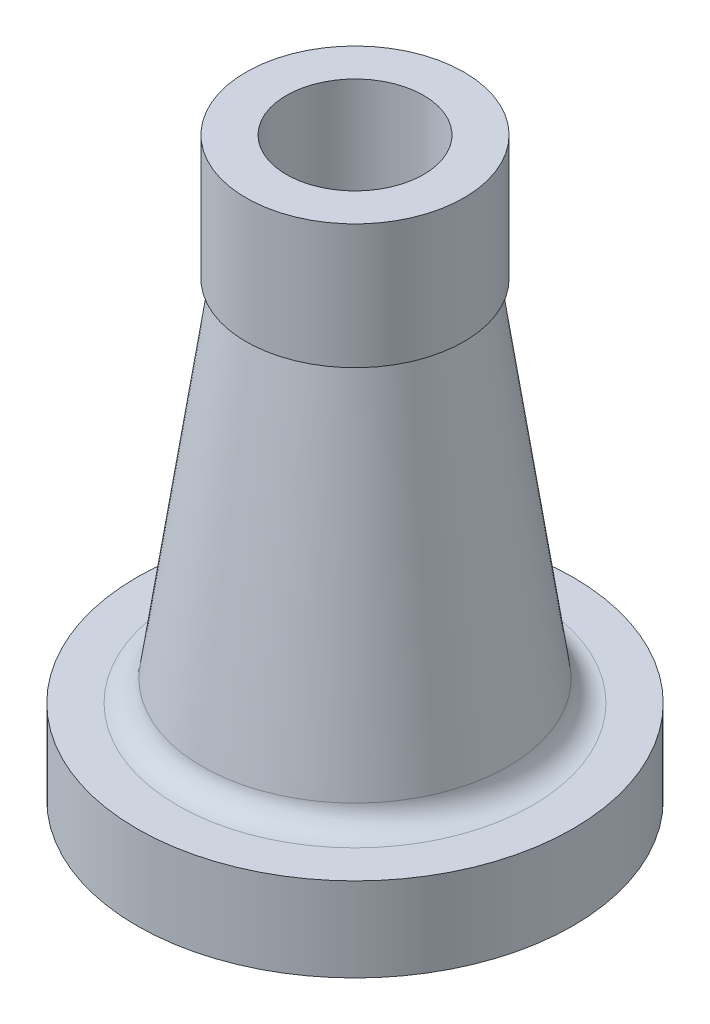
ISO-10303-21;
HEADER;
FILE_DESCRIPTION(('STEP AP214'),'2;1');
FILE_NAME('part.step','',(''),(''),'','','');
FILE_SCHEMA(('AUTOMOTIVE_DESIGN { 1 0 10303 214 1 1 1 1 }'));
ENDSEC;
DATA;
#1=APPLICATION_CONTEXT('core data for automotive mechanical design processes');
#2=APPLICATION_PROTOCOL_DEFINITION('international standard','automotive_design',2000,#1);
#3=PRODUCT_CONTEXT('',#1,'mechanical');
#4=PRODUCT('Part','Part','',(#3));
#5=PRODUCT_RELATED_PRODUCT_CATEGORY('part','',(#4));
#6=PRODUCT_DEFINITION_FORMATION('','',#4);
#7=PRODUCT_DEFINITION_CONTEXT('part definition',#1,'design');
#8=PRODUCT_DEFINITION('design','',#6,#7);
#9=PRODUCT_DEFINITION_SHAPE('','',#8);
#10=(LENGTH_UNIT() NAMED_UNIT(*) SI_UNIT(.MILLI.,.METRE.));
#11=(NAMED_UNIT(*) PLANE_ANGLE_UNIT() SI_UNIT($,.RADIAN.));
#12=(NAMED_UNIT(*) SI_UNIT($,.STERADIAN.) SOLID_ANGLE_UNIT());
#13=UNCERTAINTY_MEASURE_WITH_UNIT(LENGTH_MEASURE(1.E-05),#10,'distance_accuracy_value','');
#14=(GEOMETRIC_REPRESENTATION_CONTEXT(3) GLOBAL_UNCERTAINTY_ASSIGNED_CONTEXT((#13)) GLOBAL_UNIT_ASSIGNED_CONTEXT((#10,
#11,#12)) REPRESENTATION_CONTEXT('',''));
#15=CARTESIAN_POINT('',(0.,0.,0.));
#16=DIRECTION('',(0.,0.,1.));
#17=DIRECTION('',(1.,0.,0.));
#18=AXIS2_PLACEMENT_3D('',#15,#16,#17);
#19=CARTESIAN_POINT('',(-50.,0.,0.));
#20=DIRECTION('',(0.,1.,0.));
#21=DIRECTION('',(0.,0.,1.));
#22=AXIS2_PLACEMENT_3D('',#19,#20,#21);
#23=PLANE('',#22);
#24=CARTESIAN_POINT('',(0.,0.,0.));
#25=DIRECTION('',(0.,-1.,0.));
#26=DIRECTION('',(0.,0.,-1.));
#27=AXIS2_PLACEMENT_3D('',#24,#25,#26);
#28=CIRCLE('',#27,50.);
#29=CARTESIAN_POINT('',(0.,0.,-50.));
#30=VERTEX_POINT('',#29);
#31=EDGE_CURVE('E10',#30,#30,#28,.T.);
#32=ORIENTED_EDGE('',*,*,#31,.F.);
#33=EDGE_LOOP('',(#32));
#34=FACE_BOUND('',#33,.T.);
#35=CARTESIAN_POINT('',(0.,0.,0.));
#36=DIRECTION('',(0.,-1.,0.));
#37=DIRECTION('',(0.,0.,-1.));
#38=AXIS2_PLACEMENT_3D('',#35,#36,#37);
#39=CIRCLE('',#38,70.);
#40=CARTESIAN_POINT('',(0.,0.,-70.));
#41=VERTEX_POINT('',#40);
#42=EDGE_CURVE('E77',#41,#41,#39,.T.);
#43=ORIENTED_EDGE('',*,*,#42,.T.);
#44=EDGE_LOOP('',(#43));
#45=FACE_BOUND('',#44,.T.);
#46=ADVANCED_FACE('F40',(#34,#45),#23,.F.);
#47=CARTESIAN_POINT('',(0.,0.,0.));
#48=DIRECTION('',(0.,-1.,0.));
#49=DIRECTION('',(0.,0.,-1.));
#50=AXIS2_PLACEMENT_3D('',#47,#48,#49);
#51=CYLINDRICAL_SURFACE('',#50,50.);
#52=CARTESIAN_POINT('',(0.,3.,0.));
#53=DIRECTION('',(0.,-1.,0.));
#54=DIRECTION('',(0.,0.,-1.));
#55=AXIS2_PLACEMENT_3D('',#52,#53,#54);
#56=CIRCLE('',#55,50.);
#57=CARTESIAN_POINT('',(0.,3.,-50.));
#58=VERTEX_POINT('',#57);
#59=EDGE_CURVE('E43',#58,#58,#56,.T.);
#60=ORIENTED_EDGE('',*,*,#59,.F.);
#61=EDGE_LOOP('',(#60));
#62=FACE_BOUND('',#61,.T.);
#63=ORIENTED_EDGE('',*,*,#31,.T.);
#64=EDGE_LOOP('',(#63));
#65=FACE_BOUND('',#64,.T.);
#66=ADVANCED_FACE('F138',(#62,#65),#51,.F.);
#67=CARTESIAN_POINT('',(-40.411605893821,3.,0.));
#68=DIRECTION('',(0.,1.,0.));
#69=DIRECTION('',(0.,0.,1.));
#70=AXIS2_PLACEMENT_3D('',#67,#68,#69);
#71=PLANE('',#70);
#72=CARTESIAN_POINT('',(0.,3.,0.));
#73=DIRECTION('',(0.,-1.,0.));
#74=DIRECTION('',(0.,0.,-1.));
#75=AXIS2_PLACEMENT_3D('',#72,#73,#74);
#76=CIRCLE('',#75,40.411605893821);
#77=CARTESIAN_POINT('',(0.,3.,-40.411605893821));
#78=VERTEX_POINT('',#77);
#79=EDGE_CURVE('E50',#78,#78,#76,.T.);
#80=ORIENTED_EDGE('',*,*,#79,.F.);
#81=EDGE_LOOP('',(#80));
#82=FACE_BOUND('',#81,.T.);
#83=ORIENTED_EDGE('',*,*,#59,.T.);
#84=EDGE_LOOP('',(#83));
#85=FACE_BOUND('',#84,.T.);
#86=ADVANCED_FACE('F133',(#82,#85),#71,.F.);
#87=CARTESIAN_POINT('',(0.,3.,0.));
#88=DIRECTION('',(0.,-1.,0.));
#89=DIRECTION('',(0.,0.,-1.));
#90=AXIS2_PLACEMENT_3D('',#87,#88,#89);
#91=CONICAL_SURFACE('',#90,40.411605893821,0.143699780089837);
#92=CARTESIAN_POINT('',(0.,130.,0.));
#93=DIRECTION('',(0.,-1.,0.));
#94=DIRECTION('',(0.,0.,-1.));
#95=AXIS2_PLACEMENT_3D('',#92,#93,#94);
#96=CIRCLE('',#95,22.0350698111545);
#97=CARTESIAN_POINT('',(0.,130.,-22.0350698111545));
#98=VERTEX_POINT('',#97);
#99=EDGE_CURVE('E51',#98,#98,#96,.T.);
#100=ORIENTED_EDGE('',*,*,#99,.F.);
#101=EDGE_LOOP('',(#100));
#102=FACE_BOUND('',#101,.T.);
#103=ORIENTED_EDGE('',*,*,#79,.T.);
#104=EDGE_LOOP('',(#103));
#105=FACE_BOUND('',#104,.T.);
#106=ADVANCED_FACE('F130',(#102,#105),#91,.F.);
#107=CARTESIAN_POINT('',(0.,0.,0.));
#108=DIRECTION('',(0.,-1.,0.));
#109=DIRECTION('',(0.,0.,-1.));
#110=AXIS2_PLACEMENT_3D('',#107,#108,#109);
#111=CYLINDRICAL_SURFACE('',#110,22.0350698111545);
#112=CARTESIAN_POINT('',(0.,185.,0.));
#113=DIRECTION('',(0.,-1.,0.));
#114=DIRECTION('',(0.,0.,-1.));
#115=AXIS2_PLACEMENT_3D('',#112,#113,#114);
#116=CIRCLE('',#115,22.0350698111545);
#117=CARTESIAN_POINT('',(0.,185.,-22.0350698111545));
#118=VERTEX_POINT('',#117);
#119=EDGE_CURVE('E57',#118,#118,#116,.T.);
#120=ORIENTED_EDGE('',*,*,#119,.F.);
#121=EDGE_LOOP('',(#120));
#122=FACE_BOUND('',#121,.T.);
#123=ORIENTED_EDGE('',*,*,#99,.T.);
#124=EDGE_LOOP('',(#123));
#125=FACE_BOUND('',#124,.T.);
#126=ADVANCED_FACE('F123',(#122,#125),#111,.F.);
#127=CARTESIAN_POINT('',(-35.,185.,0.));
#128=DIRECTION('',(0.,-1.,0.));
#129=DIRECTION('',(0.,0.,-1.));
#130=AXIS2_PLACEMENT_3D('',#127,#128,#129);
#131=PLANE('',#130);
#132=CARTESIAN_POINT('',(0.,185.,0.));
#133=DIRECTION('',(0.,-1.,0.));
#134=DIRECTION('',(0.,0.,-1.));
#135=AXIS2_PLACEMENT_3D('',#132,#133,#134);
#136=CIRCLE('',#135,35.);
#137=CARTESIAN_POINT('',(0.,185.,-35.));
#138=VERTEX_POINT('',#137);
#139=EDGE_CURVE('E56',#138,#138,#136,.T.);
#140=ORIENTED_EDGE('',*,*,#139,.F.);
#141=EDGE_LOOP('',(#140));
#142=FACE_BOUND('',#141,.T.);
#143=ORIENTED_EDGE('',*,*,#119,.T.);
#144=EDGE_LOOP('',(#143));
#145=FACE_BOUND('',#144,.T.);
#146=ADVANCED_FACE('F113',(#142,#145),#131,.F.);
#147=CARTESIAN_POINT('',(0.,0.,0.));
#148=DIRECTION('',(0.,-1.,0.));
#149=DIRECTION('',(0.,0.,-1.));
#150=AXIS2_PLACEMENT_3D('',#147,#148,#149);
#151=CYLINDRICAL_SURFACE('',#150,35.);
#152=CARTESIAN_POINT('',(0.,145.,0.));
#153=DIRECTION('',(0.,-1.,0.));
#154=DIRECTION('',(0.,0.,-1.));
#155=AXIS2_PLACEMENT_3D('',#152,#153,#154);
#156=CIRCLE('',#155,35.);
#157=CARTESIAN_POINT('',(0.,145.,-35.));
#158=VERTEX_POINT('',#157);
#159=EDGE_CURVE('E65',#158,#158,#156,.T.);
#160=ORIENTED_EDGE('',*,*,#159,.F.);
#161=EDGE_LOOP('',(#160));
#162=FACE_BOUND('',#161,.T.);
#163=ORIENTED_EDGE('',*,*,#139,.T.);
#164=EDGE_LOOP('',(#163));
#165=FACE_BOUND('',#164,.T.);
#166=ADVANCED_FACE('F109',(#162,#165),#151,.T.);
#167=CARTESIAN_POINT('',(-33.,145.,0.));
#168=DIRECTION('',(0.,1.,0.));
#169=DIRECTION('',(0.,0.,1.));
#170=AXIS2_PLACEMENT_3D('',#167,#168,#169);
#171=PLANE('',#170);
#172=CARTESIAN_POINT('',(0.,145.,0.));
#173=DIRECTION('',(0.,-1.,0.));
#174=DIRECTION('',(0.,0.,-1.));
#175=AXIS2_PLACEMENT_3D('',#172,#173,#174);
#176=CIRCLE('',#175,33.);
#177=CARTESIAN_POINT('',(0.,145.,-33.));
#178=VERTEX_POINT('',#177);
#179=EDGE_CURVE('E61',#178,#178,#176,.T.);
#180=ORIENTED_EDGE('',*,*,#179,.F.);
#181=EDGE_LOOP('',(#180));
#182=FACE_BOUND('',#181,.T.);
#183=ORIENTED_EDGE('',*,*,#159,.T.);
#184=EDGE_LOOP('',(#183));
#185=FACE_BOUND('',#184,.T.);
#186=ADVANCED_FACE('F104',(#182,#185),#171,.F.);
#187=CARTESIAN_POINT('',(0.,145.,0.));
#188=DIRECTION('',(0.,-1.,0.));
#189=DIRECTION('',(0.,0.,-1.));
#190=AXIS2_PLACEMENT_3D('',#187,#188,#189);
#191=CONICAL_SURFACE('',#190,33.,0.143699780089837);
#192=CARTESIAN_POINT('',(0.,33.8543541387552,0.));
#193=DIRECTION('',(0.,-1.,0.));
#194=DIRECTION('',(0.,0.,-1.));
#195=AXIS2_PLACEMENT_3D('',#192,#193,#194);
#196=CIRCLE('',#195,49.0824564692947);
#197=CARTESIAN_POINT('',(0.,33.8543541387552,-49.0824564692947));
#198=VERTEX_POINT('',#197);
#199=EDGE_CURVE('E66',#198,#198,#196,.T.);
#200=ORIENTED_EDGE('',*,*,#199,.F.);
#201=EDGE_LOOP('',(#200));
#202=FACE_BOUND('',#201,.T.);
#203=ORIENTED_EDGE('',*,*,#179,.T.);
#204=EDGE_LOOP('',(#203));
#205=FACE_BOUND('',#204,.T.);
#206=ADVANCED_FACE('F100',(#202,#205),#191,.T.);
#207=CARTESIAN_POINT('',(0.,35.,0.));
#208=DIRECTION('',(0.,-1.,0.));
#209=DIRECTION('',(0.,0.,-1.));
#210=AXIS2_PLACEMENT_3D('',#207,#208,#209);
#211=TOROIDAL_SURFACE('',#210,57.,8.);
#212=CARTESIAN_POINT('',(0.,27.,0.));
#213=DIRECTION('',(0.,-1.,0.));
#214=DIRECTION('',(0.,0.,-1.));
#215=AXIS2_PLACEMENT_3D('',#212,#213,#214);
#216=CIRCLE('',#215,57.);
#217=CARTESIAN_POINT('',(0.,27.,-57.));
#218=VERTEX_POINT('',#217);
#219=EDGE_CURVE('E72',#218,#218,#216,.T.);
#220=ORIENTED_EDGE('',*,*,#219,.F.);
#221=EDGE_LOOP('',(#220));
#222=FACE_BOUND('',#221,.T.);
#223=ORIENTED_EDGE('',*,*,#199,.T.);
#224=EDGE_LOOP('',(#223));
#225=FACE_BOUND('',#224,.T.);
#226=ADVANCED_FACE('F91',(#222,#225),#211,.F.);
#227=CARTESIAN_POINT('',(-70.,27.,0.));
#228=DIRECTION('',(0.,-1.,0.));
#229=DIRECTION('',(0.,0.,-1.));
#230=AXIS2_PLACEMENT_3D('',#227,#228,#229);
#231=PLANE('',#230);
#232=CARTESIAN_POINT('',(0.,27.,0.));
#233=DIRECTION('',(0.,-1.,0.));
#234=DIRECTION('',(0.,0.,-1.));
#235=AXIS2_PLACEMENT_3D('',#232,#233,#234);
#236=CIRCLE('',#235,70.);
#237=CARTESIAN_POINT('',(0.,27.,-70.));
#238=VERTEX_POINT('',#237);
#239=EDGE_CURVE('E74',#238,#238,#236,.T.);
#240=ORIENTED_EDGE('',*,*,#239,.F.);
#241=EDGE_LOOP('',(#240));
#242=FACE_BOUND('',#241,.T.);
#243=ORIENTED_EDGE('',*,*,#219,.T.);
#244=EDGE_LOOP('',(#243));
#245=FACE_BOUND('',#244,.T.);
#246=ADVANCED_FACE('F82',(#242,#245),#231,.F.);
#247=CARTESIAN_POINT('',(0.,0.,0.));
#248=DIRECTION('',(0.,-1.,0.));
#249=DIRECTION('',(0.,0.,-1.));
#250=AXIS2_PLACEMENT_3D('',#247,#248,#249);
#251=CYLINDRICAL_SURFACE('',#250,70.);
#252=ORIENTED_EDGE('',*,*,#42,.F.);
#253=EDGE_LOOP('',(#252));
#254=FACE_BOUND('',#253,.T.);
#255=ORIENTED_EDGE('',*,*,#239,.T.);
#256=EDGE_LOOP('',(#255));
#257=FACE_BOUND('',#256,.T.);
#258=ADVANCED_FACE('F85',(#254,#257),#251,.T.);
#259=CLOSED_SHELL('',(#46,#66,#86,#106,#126,#146,#166,#186,#206,#226,#246,#258));
#260=MANIFOLD_SOLID_BREP('B2',#259);
#261=ADVANCED_BREP_SHAPE_REPRESENTATION('',(#18,#260),#14);
#262=SHAPE_DEFINITION_REPRESENTATION(#9,#261);
ENDSEC;
END-ISO-10303-21;
